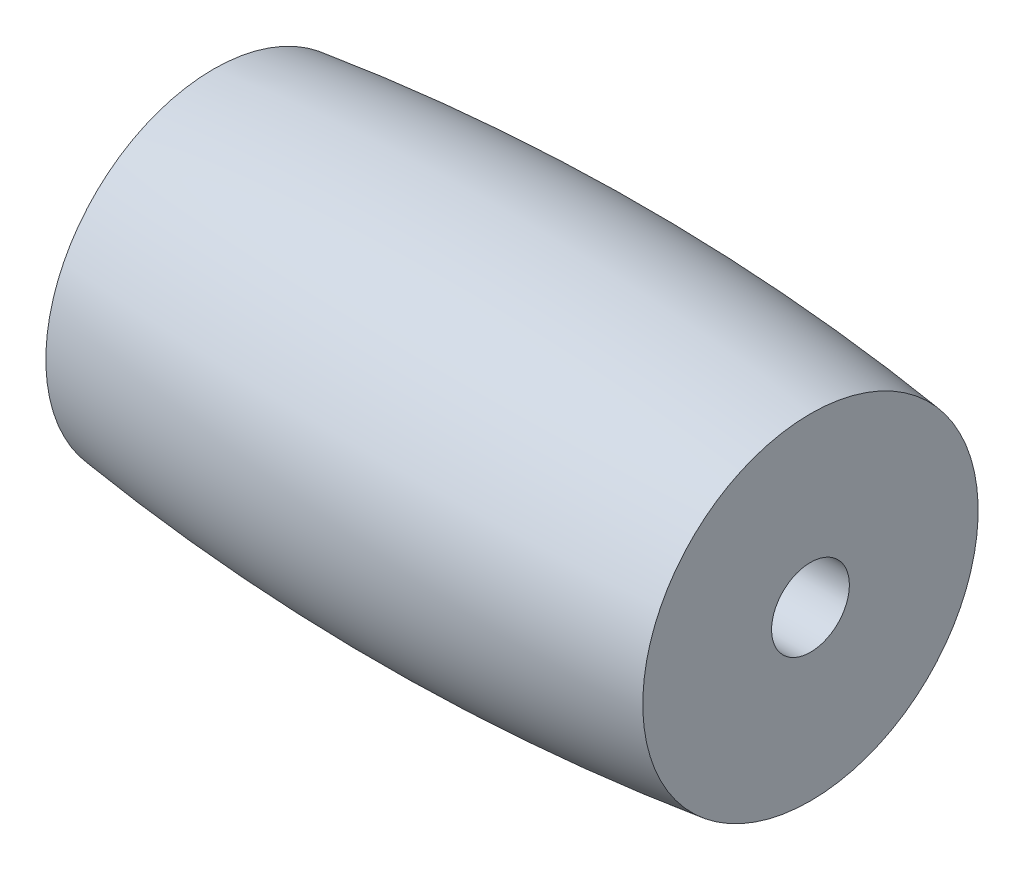
ISO-10303-21;
HEADER;
FILE_DESCRIPTION(('STEP AP214'),'2;1');
FILE_NAME('part.step','',(''),(''),'','','');
FILE_SCHEMA(('AUTOMOTIVE_DESIGN { 1 0 10303 214 1 1 1 1 }'));
ENDSEC;
DATA;
#1=APPLICATION_CONTEXT('core data for automotive mechanical design processes');
#2=APPLICATION_PROTOCOL_DEFINITION('international standard','automotive_design',2000,#1);
#3=PRODUCT_CONTEXT('',#1,'mechanical');
#4=PRODUCT('Part','Part','',(#3));
#5=PRODUCT_RELATED_PRODUCT_CATEGORY('part','',(#4));
#6=PRODUCT_DEFINITION_FORMATION('','',#4);
#7=PRODUCT_DEFINITION_CONTEXT('part definition',#1,'design');
#8=PRODUCT_DEFINITION('design','',#6,#7);
#9=PRODUCT_DEFINITION_SHAPE('','',#8);
#10=(LENGTH_UNIT() NAMED_UNIT(*) SI_UNIT(.MILLI.,.METRE.));
#11=(NAMED_UNIT(*) PLANE_ANGLE_UNIT() SI_UNIT($,.RADIAN.));
#12=(NAMED_UNIT(*) SI_UNIT($,.STERADIAN.) SOLID_ANGLE_UNIT());
#13=UNCERTAINTY_MEASURE_WITH_UNIT(LENGTH_MEASURE(1.E-05),#10,'distance_accuracy_value','');
#14=(GEOMETRIC_REPRESENTATION_CONTEXT(3) GLOBAL_UNCERTAINTY_ASSIGNED_CONTEXT((#13)) GLOBAL_UNIT_ASSIGNED_CONTEXT((#10,
#11,#12)) REPRESENTATION_CONTEXT('',''));
#15=CARTESIAN_POINT('',(0.,0.,0.));
#16=DIRECTION('',(0.,0.,1.));
#17=DIRECTION('',(1.,0.,0.));
#18=AXIS2_PLACEMENT_3D('',#15,#16,#17);
#19=CARTESIAN_POINT('',(0.,0.,0.));
#20=DIRECTION('',(1.,0.,0.));
#21=DIRECTION('',(0.,1.,0.));
#22=AXIS2_PLACEMENT_3D('',#19,#20,#21);
#23=CYLINDRICAL_SURFACE('',#22,0.736599999999999);
#24=CARTESIAN_POINT('',(5.6515,0.,0.));
#25=DIRECTION('',(1.,0.,0.));
#26=DIRECTION('',(0.,1.,0.));
#27=AXIS2_PLACEMENT_3D('',#24,#25,#26);
#28=CIRCLE('',#27,0.736599999999999);
#29=CARTESIAN_POINT('',(5.6515,0.736599999999999,0.));
#30=VERTEX_POINT('',#29);
#31=EDGE_CURVE('E51',#30,#30,#28,.T.);
#32=ORIENTED_EDGE('',*,*,#31,.T.);
#33=EDGE_LOOP('',(#32));
#34=FACE_BOUND('',#33,.T.);
#35=CARTESIAN_POINT('',(-5.6515,0.,0.));
#36=DIRECTION('',(1.,0.,0.));
#37=DIRECTION('',(0.,1.,0.));
#38=AXIS2_PLACEMENT_3D('',#35,#36,#37);
#39=CIRCLE('',#38,0.7366);
#40=CARTESIAN_POINT('',(-5.6515,0.736599999999999,0.));
#41=VERTEX_POINT('',#40);
#42=EDGE_CURVE('E10',#41,#41,#39,.T.);
#43=ORIENTED_EDGE('',*,*,#42,.F.);
#44=EDGE_LOOP('',(#43));
#45=FACE_BOUND('',#44,.T.);
#46=ADVANCED_FACE('F37',(#34,#45),#23,.F.);
#47=CARTESIAN_POINT('',(-5.6515,0.736599999999999,0.));
#48=DIRECTION('',(-1.,0.,0.));
#49=DIRECTION('',(0.,-1.,0.));
#50=AXIS2_PLACEMENT_3D('',#47,#48,#49);
#51=PLANE('',#50);
#52=ORIENTED_EDGE('',*,*,#42,.T.);
#53=EDGE_LOOP('',(#52));
#54=FACE_BOUND('',#53,.T.);
#55=CARTESIAN_POINT('',(-5.6515,0.,0.));
#56=DIRECTION('',(1.,0.,0.));
#57=DIRECTION('',(0.,1.,0.));
#58=AXIS2_PLACEMENT_3D('',#55,#56,#57);
#59=CIRCLE('',#58,3.17500000000001);
#60=CARTESIAN_POINT('',(-5.6515,3.175,0.));
#61=VERTEX_POINT('',#60);
#62=EDGE_CURVE('E43',#61,#61,#59,.T.);
#63=ORIENTED_EDGE('',*,*,#62,.F.);
#64=EDGE_LOOP('',(#63));
#65=FACE_BOUND('',#64,.T.);
#66=ADVANCED_FACE('F67',(#54,#65),#51,.T.);
#67=CARTESIAN_POINT('',(0.,0.,0.));
#68=DIRECTION('',(1.,0.,0.));
#69=DIRECTION('',(0.,1.,0.));
#70=AXIS2_PLACEMENT_3D('',#67,#68,#69);
#71=DEGENERATE_TOROIDAL_SURFACE('',#70,41.5564410714284,45.0870410714284,.F.);
#72=ORIENTED_EDGE('',*,*,#62,.T.);
#73=EDGE_LOOP('',(#72));
#74=FACE_BOUND('',#73,.T.);
#75=CARTESIAN_POINT('',(5.6515,0.,0.));
#76=DIRECTION('',(1.,0.,0.));
#77=DIRECTION('',(0.,1.,0.));
#78=AXIS2_PLACEMENT_3D('',#75,#76,#77);
#79=CIRCLE('',#78,3.175);
#80=CARTESIAN_POINT('',(5.6515,3.175,0.));
#81=VERTEX_POINT('',#80);
#82=EDGE_CURVE('E47',#81,#81,#79,.T.);
#83=ORIENTED_EDGE('',*,*,#82,.F.);
#84=EDGE_LOOP('',(#83));
#85=FACE_BOUND('',#84,.T.);
#86=ADVANCED_FACE('F61',(#74,#85),#71,.F.);
#87=CARTESIAN_POINT('',(5.6515,0.736599999999999,0.));
#88=DIRECTION('',(1.,0.,0.));
#89=DIRECTION('',(0.,1.,0.));
#90=AXIS2_PLACEMENT_3D('',#87,#88,#89);
#91=PLANE('',#90);
#92=ORIENTED_EDGE('',*,*,#82,.T.);
#93=EDGE_LOOP('',(#92));
#94=FACE_BOUND('',#93,.T.);
#95=ORIENTED_EDGE('',*,*,#31,.F.);
#96=EDGE_LOOP('',(#95));
#97=FACE_BOUND('',#96,.T.);
#98=ADVANCED_FACE('F59',(#94,#97),#91,.T.);
#99=CLOSED_SHELL('',(#46,#66,#86,#98));
#100=MANIFOLD_SOLID_BREP('B2',#99);
#101=ADVANCED_BREP_SHAPE_REPRESENTATION('',(#18,#100),#14);
#102=SHAPE_DEFINITION_REPRESENTATION(#9,#101);
ENDSEC;
END-ISO-10303-21;
